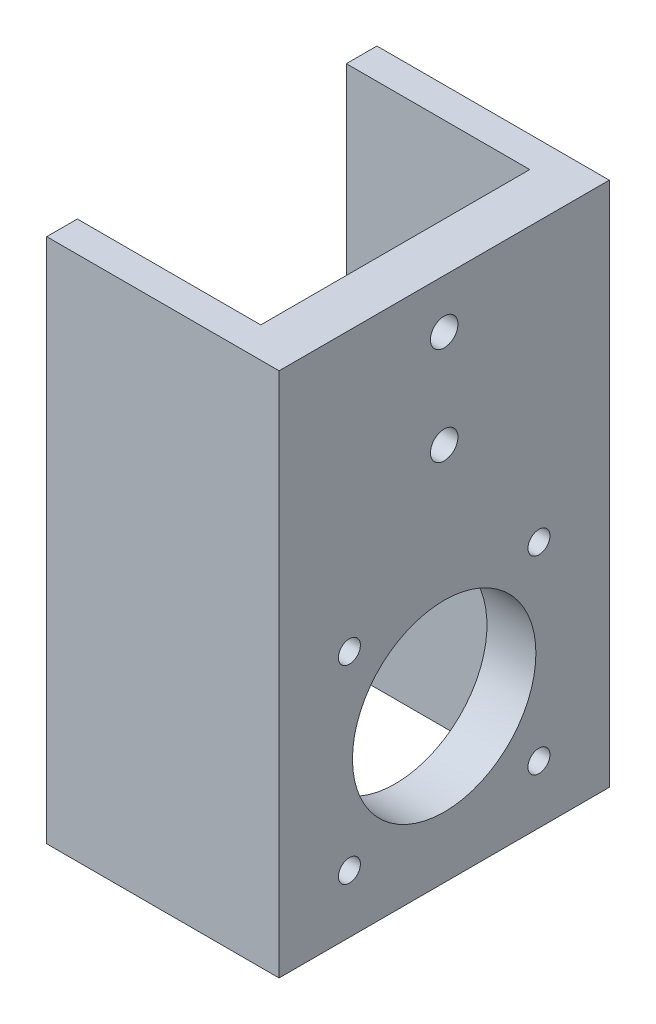
ISO-10303-21;
HEADER;
FILE_DESCRIPTION(('STEP AP214'),'2;1');
FILE_NAME('part.step','',(''),(''),'','','');
FILE_SCHEMA(('AUTOMOTIVE_DESIGN { 1 0 10303 214 1 1 1 1 }'));
ENDSEC;
DATA;
#1=APPLICATION_CONTEXT('core data for automotive mechanical design processes');
#2=APPLICATION_PROTOCOL_DEFINITION('international standard','automotive_design',2000,#1);
#3=PRODUCT_CONTEXT('',#1,'mechanical');
#4=PRODUCT('Part','Part','',(#3));
#5=PRODUCT_RELATED_PRODUCT_CATEGORY('part','',(#4));
#6=PRODUCT_DEFINITION_FORMATION('','',#4);
#7=PRODUCT_DEFINITION_CONTEXT('part definition',#1,'design');
#8=PRODUCT_DEFINITION('design','',#6,#7);
#9=PRODUCT_DEFINITION_SHAPE('','',#8);
#10=(LENGTH_UNIT() NAMED_UNIT(*) SI_UNIT(.MILLI.,.METRE.));
#11=(NAMED_UNIT(*) PLANE_ANGLE_UNIT() SI_UNIT($,.RADIAN.));
#12=(NAMED_UNIT(*) SI_UNIT($,.STERADIAN.) SOLID_ANGLE_UNIT());
#13=UNCERTAINTY_MEASURE_WITH_UNIT(LENGTH_MEASURE(1.E-05),#10,'distance_accuracy_value','');
#14=(GEOMETRIC_REPRESENTATION_CONTEXT(3) GLOBAL_UNCERTAINTY_ASSIGNED_CONTEXT((#13)) GLOBAL_UNIT_ASSIGNED_CONTEXT((#10,
#11,#12)) REPRESENTATION_CONTEXT('',''));
#15=CARTESIAN_POINT('',(0.,0.,0.));
#16=DIRECTION('',(0.,0.,1.));
#17=DIRECTION('',(1.,0.,0.));
#18=AXIS2_PLACEMENT_3D('',#15,#16,#17);
#19=CARTESIAN_POINT('',(-18.,0.,0.));
#20=DIRECTION('',(1.,0.,0.));
#21=DIRECTION('',(0.,0.,-1.));
#22=AXIS2_PLACEMENT_3D('',#19,#20,#21);
#23=PLANE('',#22);
#24=CARTESIAN_POINT('',(-18.,-5.50021935639087,-15.4997806436091));
#25=DIRECTION('',(-1.,0.,0.));
#26=DIRECTION('',(0.,0.,1.));
#27=AXIS2_PLACEMENT_3D('',#24,#25,#26);
#28=CIRCLE('',#27,1.8);
#29=CARTESIAN_POINT('',(-18.,-5.50021935639087,-13.6997806436091));
#30=VERTEX_POINT('',#29);
#31=EDGE_CURVE('E486',#30,#30,#28,.T.);
#32=ORIENTED_EDGE('',*,*,#31,.F.);
#33=EDGE_LOOP('',(#32));
#34=FACE_BOUND('',#33,.T.);
#35=CARTESIAN_POINT('',(-18.,16.,0.));
#36=DIRECTION('',(-1.,0.,0.));
#37=DIRECTION('',(0.,0.,1.));
#38=AXIS2_PLACEMENT_3D('',#35,#36,#37);
#39=CIRCLE('',#38,2.25);
#40=CARTESIAN_POINT('',(-18.,16.,2.25));
#41=VERTEX_POINT('',#40);
#42=EDGE_CURVE('E490',#41,#41,#39,.T.);
#43=ORIENTED_EDGE('',*,*,#42,.F.);
#44=EDGE_LOOP('',(#43));
#45=FACE_BOUND('',#44,.T.);
#46=CARTESIAN_POINT('',(-18.,32.,0.));
#47=DIRECTION('',(-1.,0.,0.));
#48=DIRECTION('',(0.,0.,1.));
#49=AXIS2_PLACEMENT_3D('',#46,#47,#48);
#50=CIRCLE('',#49,2.25);
#51=CARTESIAN_POINT('',(-18.,32.,2.25));
#52=VERTEX_POINT('',#51);
#53=EDGE_CURVE('E494',#52,#52,#50,.T.);
#54=ORIENTED_EDGE('',*,*,#53,.F.);
#55=EDGE_LOOP('',(#54));
#56=FACE_BOUND('',#55,.T.);
#57=CARTESIAN_POINT('',(-18.,-21.,0.));
#58=DIRECTION('',(-1.,0.,0.));
#59=DIRECTION('',(0.,0.,1.));
#60=AXIS2_PLACEMENT_3D('',#57,#58,#59);
#61=CIRCLE('',#60,15.);
#62=CARTESIAN_POINT('',(-18.,-21.,15.));
#63=VERTEX_POINT('',#62);
#64=EDGE_CURVE('E498',#63,#63,#61,.T.);
#65=ORIENTED_EDGE('',*,*,#64,.F.);
#66=EDGE_LOOP('',(#65));
#67=FACE_BOUND('',#66,.T.);
#68=CARTESIAN_POINT('',(-18.,-36.4997806436091,-15.4997806436091));
#69=DIRECTION('',(-1.,0.,0.));
#70=DIRECTION('',(0.,0.,1.));
#71=AXIS2_PLACEMENT_3D('',#68,#69,#70);
#72=CIRCLE('',#71,1.8);
#73=CARTESIAN_POINT('',(-18.,-36.4997806436091,-13.6997806436091));
#74=VERTEX_POINT('',#73);
#75=EDGE_CURVE('E502',#74,#74,#72,.T.);
#76=ORIENTED_EDGE('',*,*,#75,.F.);
#77=EDGE_LOOP('',(#76));
#78=FACE_BOUND('',#77,.T.);
#79=CARTESIAN_POINT('',(-18.,-36.4997806436091,15.4997806436091));
#80=DIRECTION('',(-1.,0.,0.));
#81=DIRECTION('',(0.,0.,1.));
#82=AXIS2_PLACEMENT_3D('',#79,#80,#81);
#83=CIRCLE('',#82,1.80000000000001);
#84=CARTESIAN_POINT('',(-18.,-36.4997806436091,17.2997806436091));
#85=VERTEX_POINT('',#84);
#86=EDGE_CURVE('E506',#85,#85,#83,.T.);
#87=ORIENTED_EDGE('',*,*,#86,.F.);
#88=EDGE_LOOP('',(#87));
#89=FACE_BOUND('',#88,.T.);
#90=CARTESIAN_POINT('',(-18.,-5.50021935639087,15.4997806436091));
#91=DIRECTION('',(-1.,0.,0.));
#92=DIRECTION('',(0.,0.,1.));
#93=AXIS2_PLACEMENT_3D('',#90,#91,#92);
#94=CIRCLE('',#93,1.8);
#95=CARTESIAN_POINT('',(-18.,-5.50021935639087,17.2997806436091));
#96=VERTEX_POINT('',#95);
#97=EDGE_CURVE('E145',#96,#96,#94,.T.);
#98=ORIENTED_EDGE('',*,*,#97,.F.);
#99=EDGE_LOOP('',(#98));
#100=FACE_BOUND('',#99,.T.);
#101=DIRECTION('',(0.,-1.,0.));
#102=VECTOR('',#101,1.);
#103=CARTESIAN_POINT('',(-18.,40.,22.));
#104=LINE('',#103,#102);
#105=CARTESIAN_POINT('',(-18.,40.,22.));
#106=VERTEX_POINT('',#105);
#107=CARTESIAN_POINT('',(-18.,-46.,22.));
#108=VERTEX_POINT('',#107);
#109=EDGE_CURVE('E118',#106,#108,#104,.T.);
#110=ORIENTED_EDGE('',*,*,#109,.F.);
#111=DIRECTION('',(0.,0.,-1.));
#112=VECTOR('',#111,1.);
#113=CARTESIAN_POINT('',(-18.,40.,-25.));
#114=LINE('',#113,#112);
#115=CARTESIAN_POINT('',(-18.,40.,-22.));
#116=VERTEX_POINT('',#115);
#117=EDGE_CURVE('E129',#106,#116,#114,.T.);
#118=ORIENTED_EDGE('',*,*,#117,.T.);
#119=DIRECTION('',(0.,-1.,0.));
#120=VECTOR('',#119,1.);
#121=CARTESIAN_POINT('',(-18.,40.,-22.));
#122=LINE('',#121,#120);
#123=CARTESIAN_POINT('',(-18.,-46.,-22.));
#124=VERTEX_POINT('',#123);
#125=EDGE_CURVE('E445',#116,#124,#122,.T.);
#126=ORIENTED_EDGE('',*,*,#125,.T.);
#127=DIRECTION('',(0.,0.,1.));
#128=VECTOR('',#127,1.);
#129=CARTESIAN_POINT('',(-18.,-46.,-25.));
#130=LINE('',#129,#128);
#131=EDGE_CURVE('E131',#124,#108,#130,.T.);
#132=ORIENTED_EDGE('',*,*,#131,.T.);
#133=EDGE_LOOP('',(#110,#118,#126,#132));
#134=FACE_BOUND('',#133,.T.);
#135=ADVANCED_FACE('F47',(#34,#45,#56,#67,#78,#89,#100,#134),#23,.F.);
#136=CARTESIAN_POINT('',(-10.,40.,10.));
#137=DIRECTION('',(1.,0.,0.));
#138=DIRECTION('',(0.,0.,-1.));
#139=AXIS2_PLACEMENT_3D('',#136,#137,#138);
#140=PLANE('',#139);
#141=DIRECTION('',(0.,0.,1.));
#142=VECTOR('',#141,1.);
#143=CARTESIAN_POINT('',(-10.,40.,10.));
#144=LINE('',#143,#142);
#145=CARTESIAN_POINT('',(-10.,40.,-27.));
#146=VERTEX_POINT('',#145);
#147=CARTESIAN_POINT('',(-9.99999999999999,40.,27.));
#148=VERTEX_POINT('',#147);
#149=EDGE_CURVE('E11',#146,#148,#144,.T.);
#150=ORIENTED_EDGE('',*,*,#149,.T.);
#151=DIRECTION('',(0.,1.,0.));
#152=VECTOR('',#151,1.);
#153=CARTESIAN_POINT('',(-9.99999999999999,-46.,27.));
#154=LINE('',#153,#152);
#155=CARTESIAN_POINT('',(-9.99999999999999,-46.,27.));
#156=VERTEX_POINT('',#155);
#157=EDGE_CURVE('E481',#156,#148,#154,.T.);
#158=ORIENTED_EDGE('',*,*,#157,.F.);
#159=DIRECTION('',(0.,0.,1.));
#160=VECTOR('',#159,1.);
#161=CARTESIAN_POINT('',(-9.99999999999999,-46.,0.));
#162=LINE('',#161,#160);
#163=CARTESIAN_POINT('',(-9.99999999999999,-46.,-27.));
#164=VERTEX_POINT('',#163);
#165=EDGE_CURVE('E139',#164,#156,#162,.T.);
#166=ORIENTED_EDGE('',*,*,#165,.F.);
#167=DIRECTION('',(0.,-1.,0.));
#168=VECTOR('',#167,1.);
#169=CARTESIAN_POINT('',(-10.,40.,-27.));
#170=LINE('',#169,#168);
#171=EDGE_CURVE('E471',#146,#164,#170,.T.);
#172=ORIENTED_EDGE('',*,*,#171,.F.);
#173=EDGE_LOOP('',(#150,#158,#166,#172));
#174=FACE_BOUND('',#173,.T.);
#175=CARTESIAN_POINT('',(-9.99999999999999,-36.4997806436091,15.4997806436091));
#176=DIRECTION('',(1.,0.,0.));
#177=DIRECTION('',(0.,0.,-1.));
#178=AXIS2_PLACEMENT_3D('',#175,#176,#177);
#179=CIRCLE('',#178,1.8);
#180=CARTESIAN_POINT('',(-9.99999999999999,-36.4997806436091,13.6997806436091));
#181=VERTEX_POINT('',#180);
#182=EDGE_CURVE('E143',#181,#181,#179,.F.);
#183=ORIENTED_EDGE('',*,*,#182,.T.);
#184=EDGE_LOOP('',(#183));
#185=FACE_BOUND('',#184,.T.);
#186=CARTESIAN_POINT('',(-9.99999999999999,-5.50021935639087,-15.4997806436091));
#187=DIRECTION('',(1.,0.,0.));
#188=DIRECTION('',(0.,0.,-1.));
#189=AXIS2_PLACEMENT_3D('',#186,#187,#188);
#190=CIRCLE('',#189,1.8);
#191=CARTESIAN_POINT('',(-9.99999999999999,-5.50021935639087,-17.2997806436091));
#192=VERTEX_POINT('',#191);
#193=EDGE_CURVE('E162',#192,#192,#190,.F.);
#194=ORIENTED_EDGE('',*,*,#193,.T.);
#195=EDGE_LOOP('',(#194));
#196=FACE_BOUND('',#195,.T.);
#197=CARTESIAN_POINT('',(-9.99999999999999,-21.,0.));
#198=DIRECTION('',(1.,0.,0.));
#199=DIRECTION('',(0.,0.,-1.));
#200=AXIS2_PLACEMENT_3D('',#197,#198,#199);
#201=CIRCLE('',#200,15.);
#202=CARTESIAN_POINT('',(-10.,-21.,-15.));
#203=VERTEX_POINT('',#202);
#204=EDGE_CURVE('E158',#203,#203,#201,.F.);
#205=ORIENTED_EDGE('',*,*,#204,.T.);
#206=EDGE_LOOP('',(#205));
#207=FACE_BOUND('',#206,.T.);
#208=CARTESIAN_POINT('',(-9.99999999999999,-36.4997806436091,-15.4997806436091));
#209=DIRECTION('',(1.,0.,0.));
#210=DIRECTION('',(0.,0.,-1.));
#211=AXIS2_PLACEMENT_3D('',#208,#209,#210);
#212=CIRCLE('',#211,1.8);
#213=CARTESIAN_POINT('',(-9.99999999999999,-36.4997806436091,-17.2997806436091));
#214=VERTEX_POINT('',#213);
#215=EDGE_CURVE('E154',#214,#214,#212,.F.);
#216=ORIENTED_EDGE('',*,*,#215,.T.);
#217=EDGE_LOOP('',(#216));
#218=FACE_BOUND('',#217,.T.);
#219=CARTESIAN_POINT('',(-9.99999999999999,-5.50021935639087,15.4997806436091));
#220=DIRECTION('',(1.,0.,0.));
#221=DIRECTION('',(0.,0.,-1.));
#222=AXIS2_PLACEMENT_3D('',#219,#220,#221);
#223=CIRCLE('',#222,1.8);
#224=CARTESIAN_POINT('',(-9.99999999999999,-5.50021935639087,13.6997806436091));
#225=VERTEX_POINT('',#224);
#226=EDGE_CURVE('E149',#225,#225,#223,.F.);
#227=ORIENTED_EDGE('',*,*,#226,.T.);
#228=EDGE_LOOP('',(#227));
#229=FACE_BOUND('',#228,.T.);
#230=CARTESIAN_POINT('',(-10.,32.,0.));
#231=DIRECTION('',(1.,0.,0.));
#232=DIRECTION('',(0.,0.,-1.));
#233=AXIS2_PLACEMENT_3D('',#230,#231,#232);
#234=CIRCLE('',#233,2.25);
#235=CARTESIAN_POINT('',(-10.,32.,-2.25));
#236=VERTEX_POINT('',#235);
#237=EDGE_CURVE('E153',#236,#236,#234,.T.);
#238=ORIENTED_EDGE('',*,*,#237,.F.);
#239=EDGE_LOOP('',(#238));
#240=FACE_BOUND('',#239,.T.);
#241=CARTESIAN_POINT('',(-10.,16.,0.));
#242=DIRECTION('',(1.,0.,0.));
#243=DIRECTION('',(0.,0.,-1.));
#244=AXIS2_PLACEMENT_3D('',#241,#242,#243);
#245=CIRCLE('',#244,2.25);
#246=CARTESIAN_POINT('',(-10.,16.,-2.25));
#247=VERTEX_POINT('',#246);
#248=EDGE_CURVE('E51',#247,#247,#245,.T.);
#249=ORIENTED_EDGE('',*,*,#248,.F.);
#250=EDGE_LOOP('',(#249));
#251=FACE_BOUND('',#250,.T.);
#252=ADVANCED_FACE('F179',(#174,#185,#196,#207,#218,#229,#240,#251),#140,.T.);
#253=CARTESIAN_POINT('',(0.,40.,0.));
#254=DIRECTION('',(0.,1.,0.));
#255=DIRECTION('',(0.,0.,1.));
#256=AXIS2_PLACEMENT_3D('',#253,#254,#255);
#257=PLANE('',#256);
#258=ORIENTED_EDGE('',*,*,#149,.F.);
#259=DIRECTION('',(1.,0.,0.));
#260=VECTOR('',#259,1.);
#261=CARTESIAN_POINT('',(-18.,40.,-27.));
#262=LINE('',#261,#260);
#263=CARTESIAN_POINT('',(-48.,40.,-27.));
#264=VERTEX_POINT('',#263);
#265=EDGE_CURVE('E464',#264,#146,#262,.T.);
#266=ORIENTED_EDGE('',*,*,#265,.F.);
#267=DIRECTION('',(0.,0.,-1.));
#268=VECTOR('',#267,1.);
#269=CARTESIAN_POINT('',(-48.,40.,-22.));
#270=LINE('',#269,#268);
#271=CARTESIAN_POINT('',(-48.,40.,-22.));
#272=VERTEX_POINT('',#271);
#273=EDGE_CURVE('E460',#272,#264,#270,.T.);
#274=ORIENTED_EDGE('',*,*,#273,.F.);
#275=DIRECTION('',(1.,0.,0.));
#276=VECTOR('',#275,1.);
#277=CARTESIAN_POINT('',(-18.,40.,-22.));
#278=LINE('',#277,#276);
#279=EDGE_CURVE('E137',#272,#116,#278,.T.);
#280=ORIENTED_EDGE('',*,*,#279,.T.);
#281=ORIENTED_EDGE('',*,*,#117,.F.);
#282=DIRECTION('',(1.,0.,0.));
#283=VECTOR('',#282,1.);
#284=CARTESIAN_POINT('',(-18.,40.,22.));
#285=LINE('',#284,#283);
#286=CARTESIAN_POINT('',(-48.,40.,22.));
#287=VERTEX_POINT('',#286);
#288=EDGE_CURVE('E115',#287,#106,#285,.T.);
#289=ORIENTED_EDGE('',*,*,#288,.F.);
#290=DIRECTION('',(0.,0.,1.));
#291=VECTOR('',#290,1.);
#292=CARTESIAN_POINT('',(-48.,40.,22.));
#293=LINE('',#292,#291);
#294=CARTESIAN_POINT('',(-48.,40.,27.));
#295=VERTEX_POINT('',#294);
#296=EDGE_CURVE('E428',#287,#295,#293,.T.);
#297=ORIENTED_EDGE('',*,*,#296,.T.);
#298=DIRECTION('',(-1.,0.,0.));
#299=VECTOR('',#298,1.);
#300=CARTESIAN_POINT('',(-9.99999999999999,40.,27.));
#301=LINE('',#300,#299);
#302=EDGE_CURVE('E435',#148,#295,#301,.T.);
#303=ORIENTED_EDGE('',*,*,#302,.F.);
#304=EDGE_LOOP('',(#258,#266,#274,#280,#281,#289,#297,#303));
#305=FACE_BOUND('',#304,.T.);
#306=ADVANCED_FACE('F49',(#305),#257,.T.);
#307=CARTESIAN_POINT('',(16.,32.,0.));
#308=DIRECTION('',(-1.,0.,0.));
#309=DIRECTION('',(0.,0.,1.));
#310=AXIS2_PLACEMENT_3D('',#307,#308,#309);
#311=CYLINDRICAL_SURFACE('',#310,2.25);
#312=ORIENTED_EDGE('',*,*,#237,.T.);
#313=EDGE_LOOP('',(#312));
#314=FACE_BOUND('',#313,.T.);
#315=ORIENTED_EDGE('',*,*,#53,.T.);
#316=EDGE_LOOP('',(#315));
#317=FACE_BOUND('',#316,.T.);
#318=ADVANCED_FACE('F186',(#314,#317),#311,.F.);
#319=CARTESIAN_POINT('',(16.,16.,0.));
#320=DIRECTION('',(-1.,0.,0.));
#321=DIRECTION('',(0.,0.,1.));
#322=AXIS2_PLACEMENT_3D('',#319,#320,#321);
#323=CYLINDRICAL_SURFACE('',#322,2.25);
#324=ORIENTED_EDGE('',*,*,#248,.T.);
#325=EDGE_LOOP('',(#324));
#326=FACE_BOUND('',#325,.T.);
#327=ORIENTED_EDGE('',*,*,#42,.T.);
#328=EDGE_LOOP('',(#327));
#329=FACE_BOUND('',#328,.T.);
#330=ADVANCED_FACE('F176',(#326,#329),#323,.F.);
#331=CARTESIAN_POINT('',(60.7106781186548,-46.,0.));
#332=DIRECTION('',(0.,-1.,0.));
#333=DIRECTION('',(0.,0.,-1.));
#334=AXIS2_PLACEMENT_3D('',#331,#332,#333);
#335=PLANE('',#334);
#336=ORIENTED_EDGE('',*,*,#131,.F.);
#337=DIRECTION('',(-1.,0.,0.));
#338=VECTOR('',#337,1.);
#339=CARTESIAN_POINT('',(-18.,-46.,-22.));
#340=LINE('',#339,#338);
#341=CARTESIAN_POINT('',(-48.,-46.,-22.));
#342=VERTEX_POINT('',#341);
#343=EDGE_CURVE('E64',#124,#342,#340,.T.);
#344=ORIENTED_EDGE('',*,*,#343,.T.);
#345=DIRECTION('',(0.,0.,-1.));
#346=VECTOR('',#345,1.);
#347=CARTESIAN_POINT('',(-48.,-46.,-22.));
#348=LINE('',#347,#346);
#349=CARTESIAN_POINT('',(-48.,-46.,-27.));
#350=VERTEX_POINT('',#349);
#351=EDGE_CURVE('E456',#342,#350,#348,.T.);
#352=ORIENTED_EDGE('',*,*,#351,.T.);
#353=DIRECTION('',(-1.,0.,0.));
#354=VECTOR('',#353,1.);
#355=CARTESIAN_POINT('',(-9.99999999999999,-46.,-27.));
#356=LINE('',#355,#354);
#357=EDGE_CURVE('E475',#164,#350,#356,.T.);
#358=ORIENTED_EDGE('',*,*,#357,.F.);
#359=ORIENTED_EDGE('',*,*,#165,.T.);
#360=DIRECTION('',(1.,0.,0.));
#361=VECTOR('',#360,1.);
#362=CARTESIAN_POINT('',(-18.,-46.,27.));
#363=LINE('',#362,#361);
#364=CARTESIAN_POINT('',(-48.,-46.,27.));
#365=VERTEX_POINT('',#364);
#366=EDGE_CURVE('E478',#365,#156,#363,.T.);
#367=ORIENTED_EDGE('',*,*,#366,.F.);
#368=DIRECTION('',(0.,0.,1.));
#369=VECTOR('',#368,1.);
#370=CARTESIAN_POINT('',(-48.,-46.,22.));
#371=LINE('',#370,#369);
#372=CARTESIAN_POINT('',(-48.,-46.,22.));
#373=VERTEX_POINT('',#372);
#374=EDGE_CURVE('E430',#373,#365,#371,.T.);
#375=ORIENTED_EDGE('',*,*,#374,.F.);
#376=DIRECTION('',(-1.,0.,0.));
#377=VECTOR('',#376,1.);
#378=CARTESIAN_POINT('',(-18.,-46.,22.));
#379=LINE('',#378,#377);
#380=EDGE_CURVE('E437',#108,#373,#379,.T.);
#381=ORIENTED_EDGE('',*,*,#380,.F.);
#382=EDGE_LOOP('',(#336,#344,#352,#358,#359,#367,#375,#381));
#383=FACE_BOUND('',#382,.T.);
#384=ADVANCED_FACE('F196',(#383),#335,.T.);
#385=CARTESIAN_POINT('',(60.7106781186548,-5.50021935639087,15.4997806436091));
#386=DIRECTION('',(-1.,0.,0.));
#387=DIRECTION('',(0.,0.,1.));
#388=AXIS2_PLACEMENT_3D('',#385,#386,#387);
#389=CYLINDRICAL_SURFACE('',#388,1.8);
#390=ORIENTED_EDGE('',*,*,#226,.F.);
#391=EDGE_LOOP('',(#390));
#392=FACE_BOUND('',#391,.T.);
#393=ORIENTED_EDGE('',*,*,#97,.T.);
#394=EDGE_LOOP('',(#393));
#395=FACE_BOUND('',#394,.T.);
#396=ADVANCED_FACE('F208',(#392,#395),#389,.F.);
#397=CARTESIAN_POINT('',(60.7106781186548,-36.4997806436091,15.4997806436091));
#398=DIRECTION('',(-1.,0.,0.));
#399=DIRECTION('',(0.,0.,1.));
#400=AXIS2_PLACEMENT_3D('',#397,#398,#399);
#401=CYLINDRICAL_SURFACE('',#400,1.8);
#402=ORIENTED_EDGE('',*,*,#182,.F.);
#403=EDGE_LOOP('',(#402));
#404=FACE_BOUND('',#403,.T.);
#405=ORIENTED_EDGE('',*,*,#86,.T.);
#406=EDGE_LOOP('',(#405));
#407=FACE_BOUND('',#406,.T.);
#408=ADVANCED_FACE('F212',(#404,#407),#401,.F.);
#409=CARTESIAN_POINT('',(60.7106781186548,-36.4997806436091,-15.4997806436091));
#410=DIRECTION('',(-1.,0.,0.));
#411=DIRECTION('',(0.,0.,1.));
#412=AXIS2_PLACEMENT_3D('',#409,#410,#411);
#413=CYLINDRICAL_SURFACE('',#412,1.8);
#414=ORIENTED_EDGE('',*,*,#215,.F.);
#415=EDGE_LOOP('',(#414));
#416=FACE_BOUND('',#415,.T.);
#417=ORIENTED_EDGE('',*,*,#75,.T.);
#418=EDGE_LOOP('',(#417));
#419=FACE_BOUND('',#418,.T.);
#420=ADVANCED_FACE('F204',(#416,#419),#413,.F.);
#421=CARTESIAN_POINT('',(60.7106781186548,-21.,0.));
#422=DIRECTION('',(-1.,0.,0.));
#423=DIRECTION('',(0.,0.,1.));
#424=AXIS2_PLACEMENT_3D('',#421,#422,#423);
#425=CYLINDRICAL_SURFACE('',#424,15.);
#426=ORIENTED_EDGE('',*,*,#204,.F.);
#427=EDGE_LOOP('',(#426));
#428=FACE_BOUND('',#427,.T.);
#429=ORIENTED_EDGE('',*,*,#64,.T.);
#430=EDGE_LOOP('',(#429));
#431=FACE_BOUND('',#430,.T.);
#432=ADVANCED_FACE('F200',(#428,#431),#425,.F.);
#433=CARTESIAN_POINT('',(60.7106781186548,-5.50021935639087,-15.4997806436091));
#434=DIRECTION('',(-1.,0.,0.));
#435=DIRECTION('',(0.,0.,1.));
#436=AXIS2_PLACEMENT_3D('',#433,#434,#435);
#437=CYLINDRICAL_SURFACE('',#436,1.8);
#438=ORIENTED_EDGE('',*,*,#193,.F.);
#439=EDGE_LOOP('',(#438));
#440=FACE_BOUND('',#439,.T.);
#441=ORIENTED_EDGE('',*,*,#31,.T.);
#442=EDGE_LOOP('',(#441));
#443=FACE_BOUND('',#442,.T.);
#444=ADVANCED_FACE('F197',(#440,#443),#437,.F.);
#445=CARTESIAN_POINT('',(0.,0.,27.));
#446=DIRECTION('',(0.,0.,1.));
#447=DIRECTION('',(1.,0.,0.));
#448=AXIS2_PLACEMENT_3D('',#445,#446,#447);
#449=PLANE('',#448);
#450=ORIENTED_EDGE('',*,*,#302,.T.);
#451=DIRECTION('',(0.,1.,0.));
#452=VECTOR('',#451,1.);
#453=CARTESIAN_POINT('',(-48.,40.,27.));
#454=LINE('',#453,#452);
#455=EDGE_CURVE('E133',#365,#295,#454,.T.);
#456=ORIENTED_EDGE('',*,*,#455,.F.);
#457=ORIENTED_EDGE('',*,*,#366,.T.);
#458=ORIENTED_EDGE('',*,*,#157,.T.);
#459=EDGE_LOOP('',(#450,#456,#457,#458));
#460=FACE_BOUND('',#459,.T.);
#461=ADVANCED_FACE('F199',(#460),#449,.T.);
#462=CARTESIAN_POINT('',(0.,0.,-27.));
#463=DIRECTION('',(0.,0.,-1.));
#464=DIRECTION('',(0.,1.,0.));
#465=AXIS2_PLACEMENT_3D('',#462,#463,#464);
#466=PLANE('',#465);
#467=ORIENTED_EDGE('',*,*,#265,.T.);
#468=ORIENTED_EDGE('',*,*,#171,.T.);
#469=ORIENTED_EDGE('',*,*,#357,.T.);
#470=DIRECTION('',(0.,1.,0.));
#471=VECTOR('',#470,1.);
#472=CARTESIAN_POINT('',(-48.,40.,-27.));
#473=LINE('',#472,#471);
#474=EDGE_CURVE('E441',#350,#264,#473,.T.);
#475=ORIENTED_EDGE('',*,*,#474,.T.);
#476=EDGE_LOOP('',(#467,#468,#469,#475));
#477=FACE_BOUND('',#476,.T.);
#478=ADVANCED_FACE('F222',(#477),#466,.T.);
#479=CARTESIAN_POINT('',(-48.,40.,-22.));
#480=DIRECTION('',(-1.,0.,0.));
#481=DIRECTION('',(0.,-1.,0.));
#482=AXIS2_PLACEMENT_3D('',#479,#480,#481);
#483=PLANE('',#482);
#484=ORIENTED_EDGE('',*,*,#474,.F.);
#485=ORIENTED_EDGE('',*,*,#351,.F.);
#486=DIRECTION('',(0.,1.,0.));
#487=VECTOR('',#486,1.);
#488=CARTESIAN_POINT('',(-48.,40.,-22.));
#489=LINE('',#488,#487);
#490=EDGE_CURVE('E450',#342,#272,#489,.T.);
#491=ORIENTED_EDGE('',*,*,#490,.T.);
#492=ORIENTED_EDGE('',*,*,#273,.T.);
#493=EDGE_LOOP('',(#484,#485,#491,#492));
#494=FACE_BOUND('',#493,.T.);
#495=ADVANCED_FACE('F225',(#494),#483,.T.);
#496=CARTESIAN_POINT('',(0.,0.,-22.));
#497=DIRECTION('',(0.,0.,-1.));
#498=DIRECTION('',(0.,1.,0.));
#499=AXIS2_PLACEMENT_3D('',#496,#497,#498);
#500=PLANE('',#499);
#501=ORIENTED_EDGE('',*,*,#125,.F.);
#502=ORIENTED_EDGE('',*,*,#279,.F.);
#503=ORIENTED_EDGE('',*,*,#490,.F.);
#504=ORIENTED_EDGE('',*,*,#343,.F.);
#505=EDGE_LOOP('',(#501,#502,#503,#504));
#506=FACE_BOUND('',#505,.T.);
#507=ADVANCED_FACE('F229',(#506),#500,.F.);
#508=CARTESIAN_POINT('',(-48.,40.,22.));
#509=DIRECTION('',(1.,0.,0.));
#510=DIRECTION('',(0.,1.,0.));
#511=AXIS2_PLACEMENT_3D('',#508,#509,#510);
#512=PLANE('',#511);
#513=ORIENTED_EDGE('',*,*,#455,.T.);
#514=ORIENTED_EDGE('',*,*,#296,.F.);
#515=DIRECTION('',(0.,1.,0.));
#516=VECTOR('',#515,1.);
#517=CARTESIAN_POINT('',(-48.,40.,22.));
#518=LINE('',#517,#516);
#519=EDGE_CURVE('E121',#373,#287,#518,.T.);
#520=ORIENTED_EDGE('',*,*,#519,.F.);
#521=ORIENTED_EDGE('',*,*,#374,.T.);
#522=EDGE_LOOP('',(#513,#514,#520,#521));
#523=FACE_BOUND('',#522,.T.);
#524=ADVANCED_FACE('F233',(#523),#512,.F.);
#525=CARTESIAN_POINT('',(0.,0.,22.));
#526=DIRECTION('',(0.,0.,1.));
#527=DIRECTION('',(0.,1.,0.));
#528=AXIS2_PLACEMENT_3D('',#525,#526,#527);
#529=PLANE('',#528);
#530=ORIENTED_EDGE('',*,*,#109,.T.);
#531=ORIENTED_EDGE('',*,*,#380,.T.);
#532=ORIENTED_EDGE('',*,*,#519,.T.);
#533=ORIENTED_EDGE('',*,*,#288,.T.);
#534=EDGE_LOOP('',(#530,#531,#532,#533));
#535=FACE_BOUND('',#534,.T.);
#536=ADVANCED_FACE('F117',(#535),#529,.F.);
#537=CLOSED_SHELL('',(#135,#252,#306,#318,#330,#384,#396,#408,#420,#432,#444,#461,#478,#495,
#507,#524,#536));
#538=MANIFOLD_SOLID_BREP('B2',#537);
#539=ADVANCED_BREP_SHAPE_REPRESENTATION('',(#18,#538),#14);
#540=SHAPE_DEFINITION_REPRESENTATION(#9,#539);
ENDSEC;
END-ISO-10303-21;
